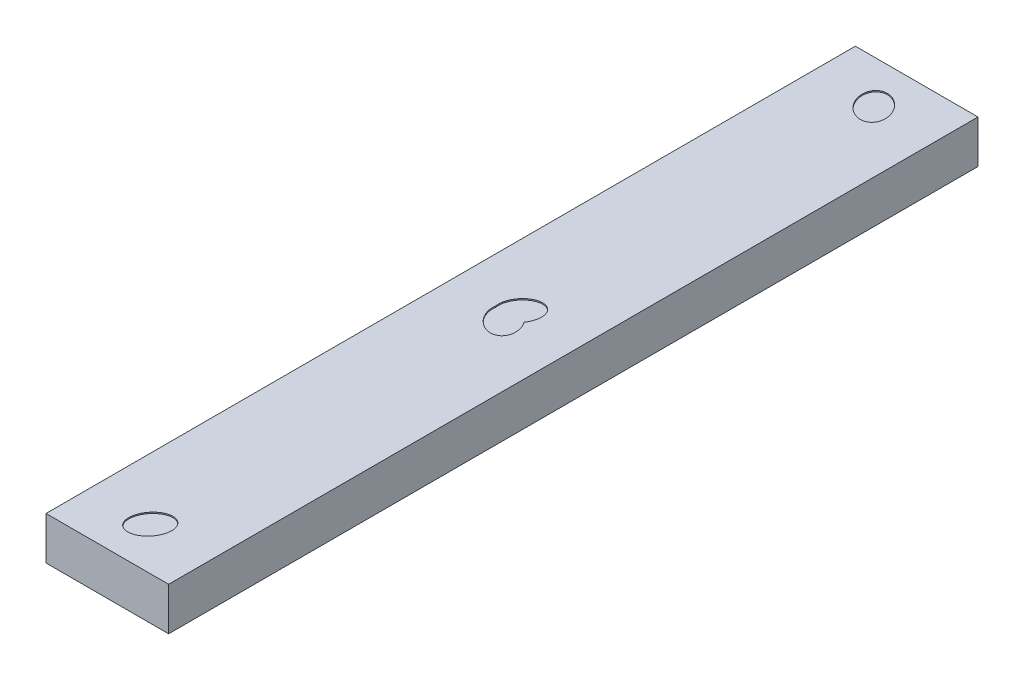
ISO-10303-21;
HEADER;
FILE_DESCRIPTION(('STEP AP214'),'2;1');
FILE_NAME('part.step','',(''),(''),'','','');
FILE_SCHEMA(('AUTOMOTIVE_DESIGN { 1 0 10303 214 1 1 1 1 }'));
ENDSEC;
DATA;
#1=APPLICATION_CONTEXT('core data for automotive mechanical design processes');
#2=APPLICATION_PROTOCOL_DEFINITION('international standard','automotive_design',2000,#1);
#3=PRODUCT_CONTEXT('',#1,'mechanical');
#4=PRODUCT('Part','Part','',(#3));
#5=PRODUCT_RELATED_PRODUCT_CATEGORY('part','',(#4));
#6=PRODUCT_DEFINITION_FORMATION('','',#4);
#7=PRODUCT_DEFINITION_CONTEXT('part definition',#1,'design');
#8=PRODUCT_DEFINITION('design','',#6,#7);
#9=PRODUCT_DEFINITION_SHAPE('','',#8);
#10=(LENGTH_UNIT() NAMED_UNIT(*) SI_UNIT(.MILLI.,.METRE.));
#11=(NAMED_UNIT(*) PLANE_ANGLE_UNIT() SI_UNIT($,.RADIAN.));
#12=(NAMED_UNIT(*) SI_UNIT($,.STERADIAN.) SOLID_ANGLE_UNIT());
#13=UNCERTAINTY_MEASURE_WITH_UNIT(LENGTH_MEASURE(1.E-05),#10,'distance_accuracy_value','');
#14=(GEOMETRIC_REPRESENTATION_CONTEXT(3) GLOBAL_UNCERTAINTY_ASSIGNED_CONTEXT((#13)) GLOBAL_UNIT_ASSIGNED_CONTEXT((#10,
#11,#12)) REPRESENTATION_CONTEXT('',''));
#15=CARTESIAN_POINT('',(0.,0.,0.));
#16=DIRECTION('',(0.,0.,1.));
#17=DIRECTION('',(1.,0.,0.));
#18=AXIS2_PLACEMENT_3D('',#15,#16,#17);
#19=CARTESIAN_POINT('',(0.,7.,0.));
#20=DIRECTION('',(0.,-1.,0.));
#21=DIRECTION('',(0.,0.,-1.));
#22=AXIS2_PLACEMENT_3D('',#19,#20,#21);
#23=PLANE('',#22);
#24=CARTESIAN_POINT('',(0.00802601358841099,7.,-58.9996300056938));
#25=DIRECTION('',(0.,-1.,0.));
#26=DIRECTION('',(0.581244318218717,0.,0.813729096529342));
#27=AXIS2_PLACEMENT_3D('',#24,#25,#26);
#28=ELLIPSE('',#27,3.2,2.375);
#29=CARTESIAN_POINT('',(1.86800783188831,7.,-56.3956968967999));
#30=VERTEX_POINT('',#29);
#31=EDGE_CURVE('E121',#30,#30,#28,.T.);
#32=ORIENTED_EDGE('',*,*,#31,.T.);
#33=EDGE_LOOP('',(#32));
#34=FACE_BOUND('',#33,.T.);
#35=CARTESIAN_POINT('',(0.00802601358841099,7.,59.));
#36=DIRECTION('',(0.,1.,0.));
#37=DIRECTION('',(0.581244318218717,0.,-0.813729096529342));
#38=AXIS2_PLACEMENT_3D('',#35,#36,#37);
#39=ELLIPSE('',#38,3.2,2.375);
#40=CARTESIAN_POINT('',(1.86800783188831,7.,56.3960668911061));
#41=VERTEX_POINT('',#40);
#42=EDGE_CURVE('E127',#41,#41,#39,.T.);
#43=ORIENTED_EDGE('',*,*,#42,.F.);
#44=EDGE_LOOP('',(#43));
#45=FACE_BOUND('',#44,.T.);
#46=DIRECTION('',(0.,0.,-1.));
#47=VECTOR('',#46,1.);
#48=CARTESIAN_POINT('',(10.,7.,66.));
#49=LINE('',#48,#47);
#50=CARTESIAN_POINT('',(10.,7.,66.));
#51=VERTEX_POINT('',#50);
#52=CARTESIAN_POINT('',(10.,7.,-66.));
#53=VERTEX_POINT('',#52);
#54=EDGE_CURVE('E199',#51,#53,#49,.T.);
#55=ORIENTED_EDGE('',*,*,#54,.T.);
#56=DIRECTION('',(-1.,0.,0.));
#57=VECTOR('',#56,1.);
#58=CARTESIAN_POINT('',(-10.,7.,-66.));
#59=LINE('',#58,#57);
#60=CARTESIAN_POINT('',(-10.,7.,-66.));
#61=VERTEX_POINT('',#60);
#62=EDGE_CURVE('E104',#53,#61,#59,.T.);
#63=ORIENTED_EDGE('',*,*,#62,.T.);
#64=DIRECTION('',(0.,0.,1.));
#65=VECTOR('',#64,1.);
#66=CARTESIAN_POINT('',(-10.,7.,66.));
#67=LINE('',#66,#65);
#68=CARTESIAN_POINT('',(-10.,7.,66.));
#69=VERTEX_POINT('',#68);
#70=EDGE_CURVE('E196',#61,#69,#67,.T.);
#71=ORIENTED_EDGE('',*,*,#70,.T.);
#72=DIRECTION('',(1.,0.,0.));
#73=VECTOR('',#72,1.);
#74=CARTESIAN_POINT('',(-10.,7.,66.));
#75=LINE('',#74,#73);
#76=EDGE_CURVE('E76',#69,#51,#75,.T.);
#77=ORIENTED_EDGE('',*,*,#76,.T.);
#78=EDGE_LOOP('',(#55,#63,#71,#77));
#79=FACE_BOUND('',#78,.T.);
#80=CARTESIAN_POINT('',(0.000308673053326693,7.,1.30962705150775));
#81=DIRECTION('',(0.,-1.,0.));
#82=DIRECTION('',(0.581244318218717,0.,0.813729096529341));
#83=AXIS2_PLACEMENT_3D('',#80,#81,#82);
#84=ELLIPSE('',#83,3.2,2.375);
#85=CARTESIAN_POINT('',(1.98256966400644,7.,0.000184997153099314));
#86=VERTEX_POINT('',#85);
#87=CARTESIAN_POINT('',(-2.6378372053883,7.,0.000184997153099319));
#88=VERTEX_POINT('',#87);
#89=EDGE_CURVE('E124',#86,#88,#84,.T.);
#90=ORIENTED_EDGE('',*,*,#89,.T.);
#91=CARTESIAN_POINT('',(0.000308673053326693,7.,-1.30925705720155));
#92=DIRECTION('',(0.,1.,0.));
#93=DIRECTION('',(0.581244318218718,0.,-0.813729096529342));
#94=AXIS2_PLACEMENT_3D('',#91,#92,#93);
#95=ELLIPSE('',#94,3.2,2.375);
#96=EDGE_CURVE('E67',#86,#88,#95,.T.);
#97=ORIENTED_EDGE('',*,*,#96,.F.);
#98=EDGE_LOOP('',(#90,#97));
#99=FACE_BOUND('',#98,.T.);
#100=ADVANCED_FACE('F52',(#34,#45,#79,#99),#23,.F.);
#101=CARTESIAN_POINT('',(10.,7.,66.));
#102=DIRECTION('',(-1.,0.,0.));
#103=DIRECTION('',(0.,0.,1.));
#104=AXIS2_PLACEMENT_3D('',#101,#102,#103);
#105=PLANE('',#104);
#106=DIRECTION('',(0.,0.,-1.));
#107=VECTOR('',#106,1.);
#108=CARTESIAN_POINT('',(10.,0.,66.));
#109=LINE('',#108,#107);
#110=CARTESIAN_POINT('',(10.,0.,66.));
#111=VERTEX_POINT('',#110);
#112=CARTESIAN_POINT('',(10.,0.,-66.));
#113=VERTEX_POINT('',#112);
#114=EDGE_CURVE('E160',#111,#113,#109,.T.);
#115=ORIENTED_EDGE('',*,*,#114,.T.);
#116=DIRECTION('',(0.,-1.,0.));
#117=VECTOR('',#116,1.);
#118=CARTESIAN_POINT('',(10.,7.,-66.));
#119=LINE('',#118,#117);
#120=EDGE_CURVE('E12',#53,#113,#119,.T.);
#121=ORIENTED_EDGE('',*,*,#120,.F.);
#122=ORIENTED_EDGE('',*,*,#54,.F.);
#123=DIRECTION('',(0.,-1.,0.));
#124=VECTOR('',#123,1.);
#125=CARTESIAN_POINT('',(10.,7.,66.));
#126=LINE('',#125,#124);
#127=EDGE_CURVE('E203',#51,#111,#126,.T.);
#128=ORIENTED_EDGE('',*,*,#127,.T.);
#129=EDGE_LOOP('',(#115,#121,#122,#128));
#130=FACE_BOUND('',#129,.T.);
#131=ADVANCED_FACE('F54',(#130),#105,.F.);
#132=CARTESIAN_POINT('',(-10.,7.,-66.));
#133=DIRECTION('',(0.,0.,1.));
#134=DIRECTION('',(1.,0.,0.));
#135=AXIS2_PLACEMENT_3D('',#132,#133,#134);
#136=PLANE('',#135);
#137=DIRECTION('',(-1.,0.,0.));
#138=VECTOR('',#137,1.);
#139=CARTESIAN_POINT('',(-10.,0.,-66.));
#140=LINE('',#139,#138);
#141=CARTESIAN_POINT('',(-10.,0.,-66.));
#142=VERTEX_POINT('',#141);
#143=EDGE_CURVE('E186',#113,#142,#140,.T.);
#144=ORIENTED_EDGE('',*,*,#143,.T.);
#145=DIRECTION('',(0.,-1.,0.));
#146=VECTOR('',#145,1.);
#147=CARTESIAN_POINT('',(-10.,7.,-66.));
#148=LINE('',#147,#146);
#149=EDGE_CURVE('E60',#61,#142,#148,.T.);
#150=ORIENTED_EDGE('',*,*,#149,.F.);
#151=ORIENTED_EDGE('',*,*,#62,.F.);
#152=ORIENTED_EDGE('',*,*,#120,.T.);
#153=EDGE_LOOP('',(#144,#150,#151,#152));
#154=FACE_BOUND('',#153,.T.);
#155=ADVANCED_FACE('F179',(#154),#136,.F.);
#156=CARTESIAN_POINT('',(-10.,7.,66.));
#157=DIRECTION('',(1.,0.,0.));
#158=DIRECTION('',(0.,0.,-1.));
#159=AXIS2_PLACEMENT_3D('',#156,#157,#158);
#160=PLANE('',#159);
#161=DIRECTION('',(0.,0.,1.));
#162=VECTOR('',#161,1.);
#163=CARTESIAN_POINT('',(-10.,0.,66.));
#164=LINE('',#163,#162);
#165=CARTESIAN_POINT('',(-10.,0.,66.));
#166=VERTEX_POINT('',#165);
#167=EDGE_CURVE('E193',#142,#166,#164,.T.);
#168=ORIENTED_EDGE('',*,*,#167,.T.);
#169=DIRECTION('',(0.,-1.,0.));
#170=VECTOR('',#169,1.);
#171=CARTESIAN_POINT('',(-10.,7.,66.));
#172=LINE('',#171,#170);
#173=EDGE_CURVE('E197',#69,#166,#172,.T.);
#174=ORIENTED_EDGE('',*,*,#173,.F.);
#175=ORIENTED_EDGE('',*,*,#70,.F.);
#176=ORIENTED_EDGE('',*,*,#149,.T.);
#177=EDGE_LOOP('',(#168,#174,#175,#176));
#178=FACE_BOUND('',#177,.T.);
#179=ADVANCED_FACE('F177',(#178),#160,.F.);
#180=CARTESIAN_POINT('',(-10.,7.,66.));
#181=DIRECTION('',(0.,0.,-1.));
#182=DIRECTION('',(-1.,0.,0.));
#183=AXIS2_PLACEMENT_3D('',#180,#181,#182);
#184=PLANE('',#183);
#185=DIRECTION('',(1.,0.,0.));
#186=VECTOR('',#185,1.);
#187=CARTESIAN_POINT('',(-10.,0.,66.));
#188=LINE('',#187,#186);
#189=EDGE_CURVE('E97',#166,#111,#188,.T.);
#190=ORIENTED_EDGE('',*,*,#189,.T.);
#191=ORIENTED_EDGE('',*,*,#127,.F.);
#192=ORIENTED_EDGE('',*,*,#76,.F.);
#193=ORIENTED_EDGE('',*,*,#173,.T.);
#194=EDGE_LOOP('',(#190,#191,#192,#193));
#195=FACE_BOUND('',#194,.T.);
#196=ADVANCED_FACE('F173',(#195),#184,.F.);
#197=CARTESIAN_POINT('',(0.,0.,0.));
#198=DIRECTION('',(0.,-1.,0.));
#199=DIRECTION('',(0.,0.,-1.));
#200=AXIS2_PLACEMENT_3D('',#197,#198,#199);
#201=PLANE('',#200);
#202=ORIENTED_EDGE('',*,*,#114,.F.);
#203=ORIENTED_EDGE('',*,*,#189,.F.);
#204=ORIENTED_EDGE('',*,*,#167,.F.);
#205=ORIENTED_EDGE('',*,*,#143,.F.);
#206=EDGE_LOOP('',(#202,#203,#204,#205));
#207=FACE_BOUND('',#206,.T.);
#208=ADVANCED_FACE('F166',(#207),#201,.T.);
#209=CARTESIAN_POINT('',(0.00802601358841099,6.8,59.));
#210=DIRECTION('',(0.,1.,0.));
#211=DIRECTION('',(0.581244318218717,0.,-0.813729096529342));
#212=AXIS2_PLACEMENT_3D('',#209,#210,#211);
#213=ELLIPSE('',#212,3.2,2.375);
#214=DIRECTION('',(0.,1.,0.));
#215=VECTOR('',#214,1.);
#216=SURFACE_OF_LINEAR_EXTRUSION('',#213,#215);
#217=CARTESIAN_POINT('',(1.86800783188831,6.8,56.3960668911061));
#218=VERTEX_POINT('',#217);
#219=EDGE_CURVE('E156',#218,#218,#213,.T.);
#220=ORIENTED_EDGE('',*,*,#219,.F.);
#221=EDGE_LOOP('',(#220));
#222=FACE_BOUND('',#221,.T.);
#223=ORIENTED_EDGE('',*,*,#42,.T.);
#224=EDGE_LOOP('',(#223));
#225=FACE_BOUND('',#224,.T.);
#226=ADVANCED_FACE('F163',(#222,#225),#216,.F.);
#227=CARTESIAN_POINT('',(0.,6.8,0.));
#228=DIRECTION('',(0.,1.,0.));
#229=DIRECTION('',(0.,0.,1.));
#230=AXIS2_PLACEMENT_3D('',#227,#228,#229);
#231=PLANE('',#230);
#232=ORIENTED_EDGE('',*,*,#219,.T.);
#233=EDGE_LOOP('',(#232));
#234=FACE_BOUND('',#233,.T.);
#235=ADVANCED_FACE('F149',(#234),#231,.T.);
#236=CARTESIAN_POINT('',(0.00802601358841099,6.8,-58.9996300056938));
#237=DIRECTION('',(0.,-1.,0.));
#238=DIRECTION('',(0.581244318218717,0.,0.813729096529342));
#239=AXIS2_PLACEMENT_3D('',#236,#237,#238);
#240=ELLIPSE('',#239,3.2,2.375);
#241=DIRECTION('',(0.,1.,0.));
#242=VECTOR('',#241,1.);
#243=SURFACE_OF_LINEAR_EXTRUSION('',#240,#242);
#244=CARTESIAN_POINT('',(1.86800783188831,6.8,-56.3956968967999));
#245=VERTEX_POINT('',#244);
#246=EDGE_CURVE('E152',#245,#245,#240,.T.);
#247=ORIENTED_EDGE('',*,*,#246,.T.);
#248=EDGE_LOOP('',(#247));
#249=FACE_BOUND('',#248,.T.);
#250=ORIENTED_EDGE('',*,*,#31,.F.);
#251=EDGE_LOOP('',(#250));
#252=FACE_BOUND('',#251,.T.);
#253=ADVANCED_FACE('F146',(#249,#252),#243,.T.);
#254=CARTESIAN_POINT('',(0.,6.8,0.));
#255=DIRECTION('',(0.,1.,0.));
#256=DIRECTION('',(0.,0.,1.));
#257=AXIS2_PLACEMENT_3D('',#254,#255,#256);
#258=PLANE('',#257);
#259=ORIENTED_EDGE('',*,*,#246,.F.);
#260=EDGE_LOOP('',(#259));
#261=FACE_BOUND('',#260,.T.);
#262=ADVANCED_FACE('F144',(#261),#258,.T.);
#263=CARTESIAN_POINT('',(0.,6.8,0.));
#264=DIRECTION('',(0.,1.,0.));
#265=DIRECTION('',(0.,0.,1.));
#266=AXIS2_PLACEMENT_3D('',#263,#264,#265);
#267=PLANE('',#266);
#268=CARTESIAN_POINT('',(0.000308673053326693,6.8,-1.30925705720155));
#269=DIRECTION('',(0.,1.,0.));
#270=DIRECTION('',(0.581244318218718,0.,-0.813729096529342));
#271=AXIS2_PLACEMENT_3D('',#268,#269,#270);
#272=ELLIPSE('',#271,3.2,2.375);
#273=CARTESIAN_POINT('',(1.98256966400644,6.8,0.000184997153099314));
#274=VERTEX_POINT('',#273);
#275=CARTESIAN_POINT('',(-2.6378372053883,6.8,0.000184997153099314));
#276=VERTEX_POINT('',#275);
#277=EDGE_CURVE('E116',#274,#276,#272,.T.);
#278=ORIENTED_EDGE('',*,*,#277,.T.);
#279=CARTESIAN_POINT('',(0.000308673053326693,6.8,1.30962705150775));
#280=DIRECTION('',(0.,-1.,0.));
#281=DIRECTION('',(0.581244318218717,0.,0.813729096529341));
#282=AXIS2_PLACEMENT_3D('',#279,#280,#281);
#283=ELLIPSE('',#282,3.2,2.375);
#284=EDGE_CURVE('E128',#274,#276,#283,.T.);
#285=ORIENTED_EDGE('',*,*,#284,.F.);
#286=EDGE_LOOP('',(#278,#285));
#287=FACE_BOUND('',#286,.T.);
#288=ADVANCED_FACE('F141',(#287),#267,.T.);
#289=DIRECTION('',(0.,1.,0.));
#290=VECTOR('',#289,1.);
#291=SURFACE_OF_LINEAR_EXTRUSION('',#272,#290);
#292=ORIENTED_EDGE('',*,*,#96,.T.);
#293=DIRECTION('',(0.,1.,0.));
#294=VECTOR('',#293,1.);
#295=CARTESIAN_POINT('',(-2.6378372053883,6.8,0.000184997153099314));
#296=LINE('',#295,#294);
#297=EDGE_CURVE('E120',#276,#88,#296,.T.);
#298=ORIENTED_EDGE('',*,*,#297,.F.);
#299=ORIENTED_EDGE('',*,*,#277,.F.);
#300=DIRECTION('',(0.,1.,0.));
#301=VECTOR('',#300,1.);
#302=CARTESIAN_POINT('',(1.98256966400644,6.8,0.000184997153099314));
#303=LINE('',#302,#301);
#304=EDGE_CURVE('E112',#274,#86,#303,.T.);
#305=ORIENTED_EDGE('',*,*,#304,.T.);
#306=EDGE_LOOP('',(#292,#298,#299,#305));
#307=FACE_BOUND('',#306,.T.);
#308=ADVANCED_FACE('F114',(#307),#291,.F.);
#309=DIRECTION('',(0.,1.,0.));
#310=VECTOR('',#309,1.);
#311=SURFACE_OF_LINEAR_EXTRUSION('',#283,#310);
#312=ORIENTED_EDGE('',*,*,#89,.F.);
#313=ORIENTED_EDGE('',*,*,#304,.F.);
#314=ORIENTED_EDGE('',*,*,#284,.T.);
#315=ORIENTED_EDGE('',*,*,#297,.T.);
#316=EDGE_LOOP('',(#312,#313,#314,#315));
#317=FACE_BOUND('',#316,.T.);
#318=ADVANCED_FACE('F125',(#317),#311,.T.);
#319=CLOSED_SHELL('',(#100,#131,#155,#179,#196,#208,#226,#235,#253,#262,#288,#308,#318));
#320=MANIFOLD_SOLID_BREP('B2',#319);
#321=ADVANCED_BREP_SHAPE_REPRESENTATION('',(#18,#320),#14);
#322=SHAPE_DEFINITION_REPRESENTATION(#9,#321);
ENDSEC;
END-ISO-10303-21;
